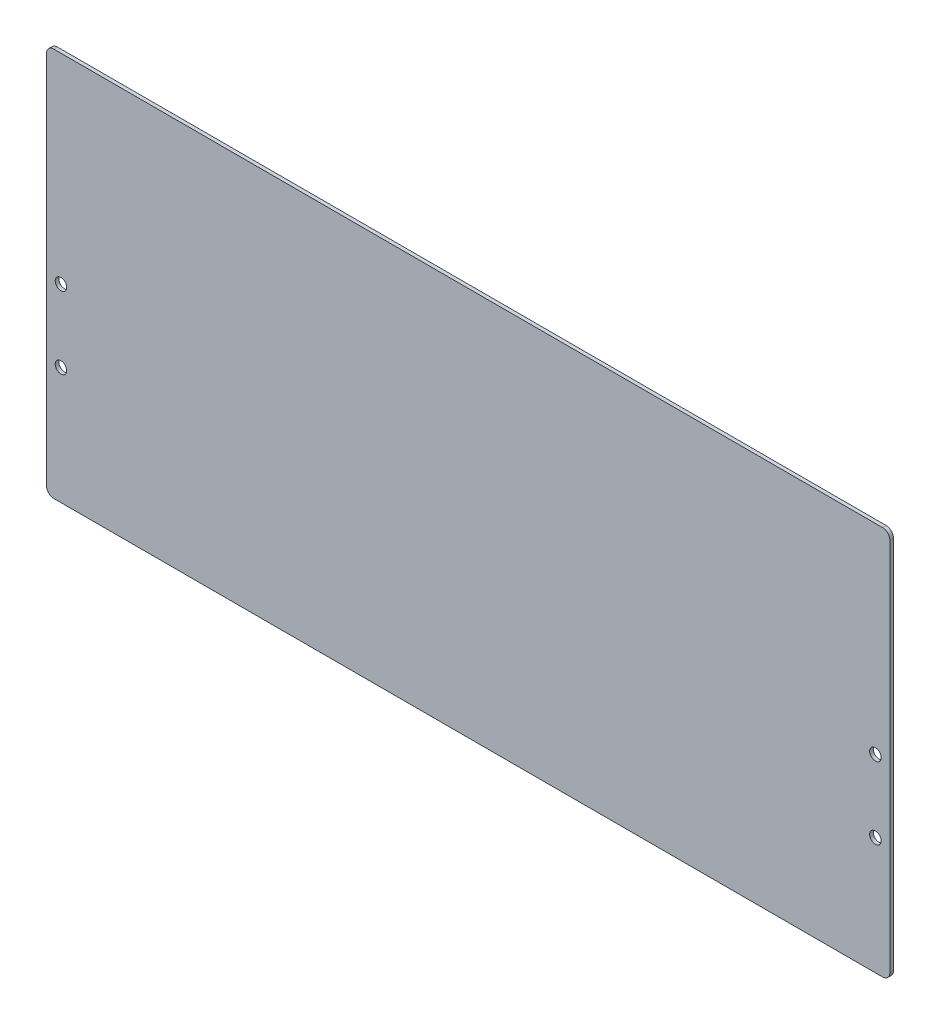
ISO-10303-21;
HEADER;
FILE_DESCRIPTION(('STEP AP214'),'2;1');
FILE_NAME('part.step','',(''),(''),'','','');
FILE_SCHEMA(('AUTOMOTIVE_DESIGN { 1 0 10303 214 1 1 1 1 }'));
ENDSEC;
DATA;
#1=APPLICATION_CONTEXT('core data for automotive mechanical design processes');
#2=APPLICATION_PROTOCOL_DEFINITION('international standard','automotive_design',2000,#1);
#3=PRODUCT_CONTEXT('',#1,'mechanical');
#4=PRODUCT('Part','Part','',(#3));
#5=PRODUCT_RELATED_PRODUCT_CATEGORY('part','',(#4));
#6=PRODUCT_DEFINITION_FORMATION('','',#4);
#7=PRODUCT_DEFINITION_CONTEXT('part definition',#1,'design');
#8=PRODUCT_DEFINITION('design','',#6,#7);
#9=PRODUCT_DEFINITION_SHAPE('','',#8);
#10=(LENGTH_UNIT() NAMED_UNIT(*) SI_UNIT(.MILLI.,.METRE.));
#11=(NAMED_UNIT(*) PLANE_ANGLE_UNIT() SI_UNIT($,.RADIAN.));
#12=(NAMED_UNIT(*) SI_UNIT($,.STERADIAN.) SOLID_ANGLE_UNIT());
#13=UNCERTAINTY_MEASURE_WITH_UNIT(LENGTH_MEASURE(1.E-05),#10,'distance_accuracy_value','');
#14=(GEOMETRIC_REPRESENTATION_CONTEXT(3) GLOBAL_UNCERTAINTY_ASSIGNED_CONTEXT((#13)) GLOBAL_UNIT_ASSIGNED_CONTEXT((#10,
#11,#12)) REPRESENTATION_CONTEXT('',''));
#15=CARTESIAN_POINT('',(0.,0.,0.));
#16=DIRECTION('',(0.,0.,1.));
#17=DIRECTION('',(1.,0.,0.));
#18=AXIS2_PLACEMENT_3D('',#15,#16,#17);
#19=CARTESIAN_POINT('',(0.,0.,1.));
#20=DIRECTION('',(0.,0.,-1.));
#21=DIRECTION('',(-1.,0.,0.));
#22=AXIS2_PLACEMENT_3D('',#19,#20,#21);
#23=PLANE('',#22);
#24=DIRECTION('',(1.,0.,0.));
#25=VECTOR('',#24,1.);
#26=CARTESIAN_POINT('',(-117.,-54.,1.));
#27=LINE('',#26,#25);
#28=CARTESIAN_POINT('',(-115.,-54.,1.));
#29=VERTEX_POINT('',#28);
#30=CARTESIAN_POINT('',(115.,-54.,1.));
#31=VERTEX_POINT('',#30);
#32=EDGE_CURVE('E140',#29,#31,#27,.T.);
#33=ORIENTED_EDGE('',*,*,#32,.T.);
#34=CARTESIAN_POINT('',(115.,-52.,1.));
#35=DIRECTION('',(0.,0.,-1.));
#36=DIRECTION('',(-1.,0.,0.));
#37=AXIS2_PLACEMENT_3D('',#34,#35,#36);
#38=CIRCLE('',#37,2.);
#39=CARTESIAN_POINT('',(117.,-52.,1.));
#40=VERTEX_POINT('',#39);
#41=EDGE_CURVE('E159',#31,#40,#38,.F.);
#42=ORIENTED_EDGE('',*,*,#41,.T.);
#43=DIRECTION('',(0.,1.,0.));
#44=VECTOR('',#43,1.);
#45=CARTESIAN_POINT('',(117.,-54.,1.));
#46=LINE('',#45,#44);
#47=CARTESIAN_POINT('',(117.,52.,1.));
#48=VERTEX_POINT('',#47);
#49=EDGE_CURVE('E123',#40,#48,#46,.T.);
#50=ORIENTED_EDGE('',*,*,#49,.T.);
#51=CARTESIAN_POINT('',(115.,52.,1.));
#52=DIRECTION('',(0.,0.,-1.));
#53=DIRECTION('',(-1.,0.,0.));
#54=AXIS2_PLACEMENT_3D('',#51,#52,#53);
#55=CIRCLE('',#54,2.);
#56=CARTESIAN_POINT('',(115.,54.,1.));
#57=VERTEX_POINT('',#56);
#58=EDGE_CURVE('E154',#48,#57,#55,.F.);
#59=ORIENTED_EDGE('',*,*,#58,.T.);
#60=DIRECTION('',(-1.,0.,0.));
#61=VECTOR('',#60,1.);
#62=CARTESIAN_POINT('',(-117.,54.,1.));
#63=LINE('',#62,#61);
#64=CARTESIAN_POINT('',(-115.,54.,1.));
#65=VERTEX_POINT('',#64);
#66=EDGE_CURVE('E170',#57,#65,#63,.T.);
#67=ORIENTED_EDGE('',*,*,#66,.T.);
#68=CARTESIAN_POINT('',(-115.,52.,1.));
#69=DIRECTION('',(0.,0.,-1.));
#70=DIRECTION('',(-1.,0.,0.));
#71=AXIS2_PLACEMENT_3D('',#68,#69,#70);
#72=CIRCLE('',#71,2.);
#73=CARTESIAN_POINT('',(-117.,52.,1.));
#74=VERTEX_POINT('',#73);
#75=EDGE_CURVE('E59',#65,#74,#72,.F.);
#76=ORIENTED_EDGE('',*,*,#75,.T.);
#77=DIRECTION('',(0.,-1.,0.));
#78=VECTOR('',#77,1.);
#79=CARTESIAN_POINT('',(-117.,-54.,1.));
#80=LINE('',#79,#78);
#81=CARTESIAN_POINT('',(-117.,-52.,1.));
#82=VERTEX_POINT('',#81);
#83=EDGE_CURVE('E178',#74,#82,#80,.T.);
#84=ORIENTED_EDGE('',*,*,#83,.T.);
#85=CARTESIAN_POINT('',(-115.,-52.,1.));
#86=DIRECTION('',(0.,0.,-1.));
#87=DIRECTION('',(-1.,0.,0.));
#88=AXIS2_PLACEMENT_3D('',#85,#86,#87);
#89=CIRCLE('',#88,2.);
#90=EDGE_CURVE('E157',#82,#29,#89,.F.);
#91=ORIENTED_EDGE('',*,*,#90,.T.);
#92=EDGE_LOOP('',(#33,#42,#50,#59,#67,#76,#84,#91));
#93=FACE_BOUND('',#92,.T.);
#94=CARTESIAN_POINT('',(-113.,-1.5,1.));
#95=DIRECTION('',(0.,0.,1.));
#96=DIRECTION('',(1.,0.,0.));
#97=AXIS2_PLACEMENT_3D('',#94,#95,#96);
#98=CIRCLE('',#97,1.60000000000001);
#99=CARTESIAN_POINT('',(-111.4,-1.5,1.));
#100=VERTEX_POINT('',#99);
#101=EDGE_CURVE('E131',#100,#100,#98,.T.);
#102=ORIENTED_EDGE('',*,*,#101,.F.);
#103=EDGE_LOOP('',(#102));
#104=FACE_BOUND('',#103,.T.);
#105=CARTESIAN_POINT('',(-113.,-21.5,1.));
#106=DIRECTION('',(0.,0.,1.));
#107=DIRECTION('',(1.,0.,0.));
#108=AXIS2_PLACEMENT_3D('',#105,#106,#107);
#109=CIRCLE('',#108,1.6);
#110=CARTESIAN_POINT('',(-111.4,-21.5,1.));
#111=VERTEX_POINT('',#110);
#112=EDGE_CURVE('E185',#111,#111,#109,.T.);
#113=ORIENTED_EDGE('',*,*,#112,.F.);
#114=EDGE_LOOP('',(#113));
#115=FACE_BOUND('',#114,.T.);
#116=CARTESIAN_POINT('',(113.,-21.5,1.));
#117=DIRECTION('',(0.,0.,1.));
#118=DIRECTION('',(-1.,0.,0.));
#119=AXIS2_PLACEMENT_3D('',#116,#117,#118);
#120=CIRCLE('',#119,1.6);
#121=CARTESIAN_POINT('',(111.4,-21.5,1.));
#122=VERTEX_POINT('',#121);
#123=EDGE_CURVE('E190',#122,#122,#120,.T.);
#124=ORIENTED_EDGE('',*,*,#123,.F.);
#125=EDGE_LOOP('',(#124));
#126=FACE_BOUND('',#125,.T.);
#127=CARTESIAN_POINT('',(113.,-1.49999999999997,1.));
#128=DIRECTION('',(0.,0.,1.));
#129=DIRECTION('',(-1.,0.,0.));
#130=AXIS2_PLACEMENT_3D('',#127,#128,#129);
#131=CIRCLE('',#130,1.60000000000001);
#132=CARTESIAN_POINT('',(111.4,-1.49999999999997,1.));
#133=VERTEX_POINT('',#132);
#134=EDGE_CURVE('E196',#133,#133,#131,.T.);
#135=ORIENTED_EDGE('',*,*,#134,.F.);
#136=EDGE_LOOP('',(#135));
#137=FACE_BOUND('',#136,.T.);
#138=ADVANCED_FACE('F37',(#93,#104,#115,#126,#137),#23,.F.);
#139=CARTESIAN_POINT('',(0.,0.,0.));
#140=DIRECTION('',(0.,0.,-1.));
#141=DIRECTION('',(-1.,0.,0.));
#142=AXIS2_PLACEMENT_3D('',#139,#140,#141);
#143=PLANE('',#142);
#144=CARTESIAN_POINT('',(113.,-21.5,0.));
#145=DIRECTION('',(0.,0.,1.));
#146=DIRECTION('',(-1.,0.,0.));
#147=AXIS2_PLACEMENT_3D('',#144,#145,#146);
#148=CIRCLE('',#147,1.6);
#149=CARTESIAN_POINT('',(111.4,-21.5,0.));
#150=VERTEX_POINT('',#149);
#151=EDGE_CURVE('E193',#150,#150,#148,.T.);
#152=ORIENTED_EDGE('',*,*,#151,.T.);
#153=EDGE_LOOP('',(#152));
#154=FACE_BOUND('',#153,.T.);
#155=CARTESIAN_POINT('',(-113.,-1.5,0.));
#156=DIRECTION('',(0.,0.,1.));
#157=DIRECTION('',(1.,0.,0.));
#158=AXIS2_PLACEMENT_3D('',#155,#156,#157);
#159=CIRCLE('',#158,1.60000000000001);
#160=CARTESIAN_POINT('',(-111.4,-1.5,0.));
#161=VERTEX_POINT('',#160);
#162=EDGE_CURVE('E137',#161,#161,#159,.T.);
#163=ORIENTED_EDGE('',*,*,#162,.T.);
#164=EDGE_LOOP('',(#163));
#165=FACE_BOUND('',#164,.T.);
#166=DIRECTION('',(0.,1.,0.));
#167=VECTOR('',#166,1.);
#168=CARTESIAN_POINT('',(117.,-54.,0.));
#169=LINE('',#168,#167);
#170=CARTESIAN_POINT('',(117.,-52.,0.));
#171=VERTEX_POINT('',#170);
#172=CARTESIAN_POINT('',(117.,52.,0.));
#173=VERTEX_POINT('',#172);
#174=EDGE_CURVE('E120',#171,#173,#169,.T.);
#175=ORIENTED_EDGE('',*,*,#174,.F.);
#176=CARTESIAN_POINT('',(115.,-52.,0.));
#177=DIRECTION('',(0.,0.,-1.));
#178=DIRECTION('',(-1.,0.,0.));
#179=AXIS2_PLACEMENT_3D('',#176,#177,#178);
#180=CIRCLE('',#179,2.);
#181=CARTESIAN_POINT('',(115.,-54.,0.));
#182=VERTEX_POINT('',#181);
#183=EDGE_CURVE('E103',#171,#182,#180,.T.);
#184=ORIENTED_EDGE('',*,*,#183,.T.);
#185=DIRECTION('',(1.,0.,0.));
#186=VECTOR('',#185,1.);
#187=CARTESIAN_POINT('',(-117.,-54.,0.));
#188=LINE('',#187,#186);
#189=CARTESIAN_POINT('',(-115.,-54.,0.));
#190=VERTEX_POINT('',#189);
#191=EDGE_CURVE('E144',#190,#182,#188,.T.);
#192=ORIENTED_EDGE('',*,*,#191,.F.);
#193=CARTESIAN_POINT('',(-115.,-52.,0.));
#194=DIRECTION('',(0.,0.,-1.));
#195=DIRECTION('',(-1.,0.,0.));
#196=AXIS2_PLACEMENT_3D('',#193,#194,#195);
#197=CIRCLE('',#196,2.);
#198=CARTESIAN_POINT('',(-117.,-52.,0.));
#199=VERTEX_POINT('',#198);
#200=EDGE_CURVE('E114',#190,#199,#197,.T.);
#201=ORIENTED_EDGE('',*,*,#200,.T.);
#202=DIRECTION('',(0.,-1.,0.));
#203=VECTOR('',#202,1.);
#204=CARTESIAN_POINT('',(-117.,-54.,0.));
#205=LINE('',#204,#203);
#206=CARTESIAN_POINT('',(-117.,52.,0.));
#207=VERTEX_POINT('',#206);
#208=EDGE_CURVE('E134',#207,#199,#205,.T.);
#209=ORIENTED_EDGE('',*,*,#208,.F.);
#210=CARTESIAN_POINT('',(-115.,52.,0.));
#211=DIRECTION('',(0.,0.,-1.));
#212=DIRECTION('',(-1.,0.,0.));
#213=AXIS2_PLACEMENT_3D('',#210,#211,#212);
#214=CIRCLE('',#213,2.);
#215=CARTESIAN_POINT('',(-115.,54.,0.));
#216=VERTEX_POINT('',#215);
#217=EDGE_CURVE('E148',#207,#216,#214,.T.);
#218=ORIENTED_EDGE('',*,*,#217,.T.);
#219=DIRECTION('',(-1.,0.,0.));
#220=VECTOR('',#219,1.);
#221=CARTESIAN_POINT('',(-117.,54.,0.));
#222=LINE('',#221,#220);
#223=CARTESIAN_POINT('',(115.,54.,0.));
#224=VERTEX_POINT('',#223);
#225=EDGE_CURVE('E130',#224,#216,#222,.T.);
#226=ORIENTED_EDGE('',*,*,#225,.F.);
#227=CARTESIAN_POINT('',(115.,52.,0.));
#228=DIRECTION('',(0.,0.,-1.));
#229=DIRECTION('',(-1.,0.,0.));
#230=AXIS2_PLACEMENT_3D('',#227,#228,#229);
#231=CIRCLE('',#230,2.);
#232=EDGE_CURVE('E124',#224,#173,#231,.T.);
#233=ORIENTED_EDGE('',*,*,#232,.T.);
#234=EDGE_LOOP('',(#175,#184,#192,#201,#209,#218,#226,#233));
#235=FACE_BOUND('',#234,.T.);
#236=CARTESIAN_POINT('',(-113.,-21.5,0.));
#237=DIRECTION('',(0.,0.,1.));
#238=DIRECTION('',(1.,0.,0.));
#239=AXIS2_PLACEMENT_3D('',#236,#237,#238);
#240=CIRCLE('',#239,1.6);
#241=CARTESIAN_POINT('',(-111.4,-21.5,0.));
#242=VERTEX_POINT('',#241);
#243=EDGE_CURVE('E187',#242,#242,#240,.T.);
#244=ORIENTED_EDGE('',*,*,#243,.T.);
#245=EDGE_LOOP('',(#244));
#246=FACE_BOUND('',#245,.T.);
#247=CARTESIAN_POINT('',(113.,-1.49999999999997,0.));
#248=DIRECTION('',(0.,0.,1.));
#249=DIRECTION('',(-1.,0.,0.));
#250=AXIS2_PLACEMENT_3D('',#247,#248,#249);
#251=CIRCLE('',#250,1.60000000000001);
#252=CARTESIAN_POINT('',(111.4,-1.49999999999997,0.));
#253=VERTEX_POINT('',#252);
#254=EDGE_CURVE('E199',#253,#253,#251,.T.);
#255=ORIENTED_EDGE('',*,*,#254,.T.);
#256=EDGE_LOOP('',(#255));
#257=FACE_BOUND('',#256,.T.);
#258=ADVANCED_FACE('F127',(#154,#165,#235,#246,#257),#143,.T.);
#259=CARTESIAN_POINT('',(117.,-54.,1.));
#260=DIRECTION('',(-1.,0.,0.));
#261=DIRECTION('',(0.,0.,1.));
#262=AXIS2_PLACEMENT_3D('',#259,#260,#261);
#263=PLANE('',#262);
#264=ORIENTED_EDGE('',*,*,#49,.F.);
#265=DIRECTION('',(0.,0.,-1.));
#266=VECTOR('',#265,1.);
#267=CARTESIAN_POINT('',(117.,-52.,1.));
#268=LINE('',#267,#266);
#269=EDGE_CURVE('E107',#40,#171,#268,.T.);
#270=ORIENTED_EDGE('',*,*,#269,.T.);
#271=ORIENTED_EDGE('',*,*,#174,.T.);
#272=DIRECTION('',(0.,0.,-1.));
#273=VECTOR('',#272,1.);
#274=CARTESIAN_POINT('',(117.,52.,1.));
#275=LINE('',#274,#273);
#276=EDGE_CURVE('E125',#173,#48,#275,.F.);
#277=ORIENTED_EDGE('',*,*,#276,.T.);
#278=EDGE_LOOP('',(#264,#270,#271,#277));
#279=FACE_BOUND('',#278,.T.);
#280=ADVANCED_FACE('F119',(#279),#263,.F.);
#281=CARTESIAN_POINT('',(-117.,54.,1.));
#282=DIRECTION('',(0.,-1.,0.));
#283=DIRECTION('',(0.,0.,-1.));
#284=AXIS2_PLACEMENT_3D('',#281,#282,#283);
#285=PLANE('',#284);
#286=ORIENTED_EDGE('',*,*,#225,.T.);
#287=DIRECTION('',(0.,0.,-1.));
#288=VECTOR('',#287,1.);
#289=CARTESIAN_POINT('',(-115.,54.,1.));
#290=LINE('',#289,#288);
#291=EDGE_CURVE('E11',#216,#65,#290,.F.);
#292=ORIENTED_EDGE('',*,*,#291,.T.);
#293=ORIENTED_EDGE('',*,*,#66,.F.);
#294=DIRECTION('',(0.,0.,-1.));
#295=VECTOR('',#294,1.);
#296=CARTESIAN_POINT('',(115.,54.,1.));
#297=LINE('',#296,#295);
#298=EDGE_CURVE('E45',#57,#224,#297,.T.);
#299=ORIENTED_EDGE('',*,*,#298,.T.);
#300=EDGE_LOOP('',(#286,#292,#293,#299));
#301=FACE_BOUND('',#300,.T.);
#302=ADVANCED_FACE('F168',(#301),#285,.F.);
#303=CARTESIAN_POINT('',(-117.,-54.,1.));
#304=DIRECTION('',(1.,0.,0.));
#305=DIRECTION('',(0.,0.,-1.));
#306=AXIS2_PLACEMENT_3D('',#303,#304,#305);
#307=PLANE('',#306);
#308=ORIENTED_EDGE('',*,*,#208,.T.);
#309=DIRECTION('',(0.,0.,-1.));
#310=VECTOR('',#309,1.);
#311=CARTESIAN_POINT('',(-117.,-52.,1.));
#312=LINE('',#311,#310);
#313=EDGE_CURVE('E52',#199,#82,#312,.F.);
#314=ORIENTED_EDGE('',*,*,#313,.T.);
#315=ORIENTED_EDGE('',*,*,#83,.F.);
#316=DIRECTION('',(0.,0.,-1.));
#317=VECTOR('',#316,1.);
#318=CARTESIAN_POINT('',(-117.,52.,1.));
#319=LINE('',#318,#317);
#320=EDGE_CURVE('E161',#74,#207,#319,.T.);
#321=ORIENTED_EDGE('',*,*,#320,.T.);
#322=EDGE_LOOP('',(#308,#314,#315,#321));
#323=FACE_BOUND('',#322,.T.);
#324=ADVANCED_FACE('F177',(#323),#307,.F.);
#325=CARTESIAN_POINT('',(-117.,-54.,1.));
#326=DIRECTION('',(0.,1.,0.));
#327=DIRECTION('',(0.,0.,1.));
#328=AXIS2_PLACEMENT_3D('',#325,#326,#327);
#329=PLANE('',#328);
#330=ORIENTED_EDGE('',*,*,#191,.T.);
#331=DIRECTION('',(0.,0.,-1.));
#332=VECTOR('',#331,1.);
#333=CARTESIAN_POINT('',(115.,-54.,1.));
#334=LINE('',#333,#332);
#335=EDGE_CURVE('E108',#182,#31,#334,.F.);
#336=ORIENTED_EDGE('',*,*,#335,.T.);
#337=ORIENTED_EDGE('',*,*,#32,.F.);
#338=DIRECTION('',(0.,0.,-1.));
#339=VECTOR('',#338,1.);
#340=CARTESIAN_POINT('',(-115.,-54.,1.));
#341=LINE('',#340,#339);
#342=EDGE_CURVE('E113',#29,#190,#341,.T.);
#343=ORIENTED_EDGE('',*,*,#342,.T.);
#344=EDGE_LOOP('',(#330,#336,#337,#343));
#345=FACE_BOUND('',#344,.T.);
#346=ADVANCED_FACE('F221',(#345),#329,.F.);
#347=CARTESIAN_POINT('',(-113.,-1.5,1.));
#348=DIRECTION('',(0.,0.,-1.));
#349=DIRECTION('',(-1.,0.,0.));
#350=AXIS2_PLACEMENT_3D('',#347,#348,#349);
#351=CYLINDRICAL_SURFACE('',#350,1.60000000000001);
#352=ORIENTED_EDGE('',*,*,#101,.T.);
#353=EDGE_LOOP('',(#352));
#354=FACE_BOUND('',#353,.T.);
#355=ORIENTED_EDGE('',*,*,#162,.F.);
#356=EDGE_LOOP('',(#355));
#357=FACE_BOUND('',#356,.T.);
#358=ADVANCED_FACE('F218',(#354,#357),#351,.F.);
#359=CARTESIAN_POINT('',(-113.,-21.5,1.));
#360=DIRECTION('',(0.,0.,-1.));
#361=DIRECTION('',(-1.,0.,0.));
#362=AXIS2_PLACEMENT_3D('',#359,#360,#361);
#363=CYLINDRICAL_SURFACE('',#362,1.6);
#364=ORIENTED_EDGE('',*,*,#112,.T.);
#365=EDGE_LOOP('',(#364));
#366=FACE_BOUND('',#365,.T.);
#367=ORIENTED_EDGE('',*,*,#243,.F.);
#368=EDGE_LOOP('',(#367));
#369=FACE_BOUND('',#368,.T.);
#370=ADVANCED_FACE('F306',(#366,#369),#363,.F.);
#371=CARTESIAN_POINT('',(113.,-21.5,1.));
#372=DIRECTION('',(0.,0.,-1.));
#373=DIRECTION('',(-1.,0.,0.));
#374=AXIS2_PLACEMENT_3D('',#371,#372,#373);
#375=CYLINDRICAL_SURFACE('',#374,1.6);
#376=ORIENTED_EDGE('',*,*,#123,.T.);
#377=EDGE_LOOP('',(#376));
#378=FACE_BOUND('',#377,.T.);
#379=ORIENTED_EDGE('',*,*,#151,.F.);
#380=EDGE_LOOP('',(#379));
#381=FACE_BOUND('',#380,.T.);
#382=ADVANCED_FACE('F314',(#378,#381),#375,.F.);
#383=CARTESIAN_POINT('',(113.,-1.49999999999997,1.));
#384=DIRECTION('',(0.,0.,-1.));
#385=DIRECTION('',(-1.,0.,0.));
#386=AXIS2_PLACEMENT_3D('',#383,#384,#385);
#387=CYLINDRICAL_SURFACE('',#386,1.60000000000001);
#388=ORIENTED_EDGE('',*,*,#134,.T.);
#389=EDGE_LOOP('',(#388));
#390=FACE_BOUND('',#389,.T.);
#391=ORIENTED_EDGE('',*,*,#254,.F.);
#392=EDGE_LOOP('',(#391));
#393=FACE_BOUND('',#392,.T.);
#394=ADVANCED_FACE('F205',(#390,#393),#387,.F.);
#395=CARTESIAN_POINT('',(115.,-52.,1.));
#396=DIRECTION('',(0.,0.,-1.));
#397=DIRECTION('',(-1.,0.,0.));
#398=AXIS2_PLACEMENT_3D('',#395,#396,#397);
#399=CYLINDRICAL_SURFACE('',#398,2.);
#400=ORIENTED_EDGE('',*,*,#41,.F.);
#401=ORIENTED_EDGE('',*,*,#335,.F.);
#402=ORIENTED_EDGE('',*,*,#183,.F.);
#403=ORIENTED_EDGE('',*,*,#269,.F.);
#404=EDGE_LOOP('',(#400,#401,#402,#403));
#405=FACE_BOUND('',#404,.T.);
#406=ADVANCED_FACE('F106',(#405),#399,.T.);
#407=CARTESIAN_POINT('',(-115.,-52.,1.));
#408=DIRECTION('',(0.,0.,-1.));
#409=DIRECTION('',(-1.,0.,0.));
#410=AXIS2_PLACEMENT_3D('',#407,#408,#409);
#411=CYLINDRICAL_SURFACE('',#410,2.);
#412=ORIENTED_EDGE('',*,*,#90,.F.);
#413=ORIENTED_EDGE('',*,*,#313,.F.);
#414=ORIENTED_EDGE('',*,*,#200,.F.);
#415=ORIENTED_EDGE('',*,*,#342,.F.);
#416=EDGE_LOOP('',(#412,#413,#414,#415));
#417=FACE_BOUND('',#416,.T.);
#418=ADVANCED_FACE('F233',(#417),#411,.T.);
#419=CARTESIAN_POINT('',(-115.,52.,1.));
#420=DIRECTION('',(0.,0.,-1.));
#421=DIRECTION('',(-1.,0.,0.));
#422=AXIS2_PLACEMENT_3D('',#419,#420,#421);
#423=CYLINDRICAL_SURFACE('',#422,2.);
#424=ORIENTED_EDGE('',*,*,#75,.F.);
#425=ORIENTED_EDGE('',*,*,#291,.F.);
#426=ORIENTED_EDGE('',*,*,#217,.F.);
#427=ORIENTED_EDGE('',*,*,#320,.F.);
#428=EDGE_LOOP('',(#424,#425,#426,#427));
#429=FACE_BOUND('',#428,.T.);
#430=ADVANCED_FACE('F176',(#429),#423,.T.);
#431=CARTESIAN_POINT('',(115.,52.,1.));
#432=DIRECTION('',(0.,0.,-1.));
#433=DIRECTION('',(-1.,0.,0.));
#434=AXIS2_PLACEMENT_3D('',#431,#432,#433);
#435=CYLINDRICAL_SURFACE('',#434,2.);
#436=ORIENTED_EDGE('',*,*,#58,.F.);
#437=ORIENTED_EDGE('',*,*,#276,.F.);
#438=ORIENTED_EDGE('',*,*,#232,.F.);
#439=ORIENTED_EDGE('',*,*,#298,.F.);
#440=EDGE_LOOP('',(#436,#437,#438,#439));
#441=FACE_BOUND('',#440,.T.);
#442=ADVANCED_FACE('F39',(#441),#435,.T.);
#443=CLOSED_SHELL('',(#138,#258,#280,#302,#324,#346,#358,#370,#382,#394,#406,#418,#430,#442));
#444=MANIFOLD_SOLID_BREP('B2',#443);
#445=ADVANCED_BREP_SHAPE_REPRESENTATION('',(#18,#444),#14);
#446=SHAPE_DEFINITION_REPRESENTATION(#9,#445);
ENDSEC;
END-ISO-10303-21;
